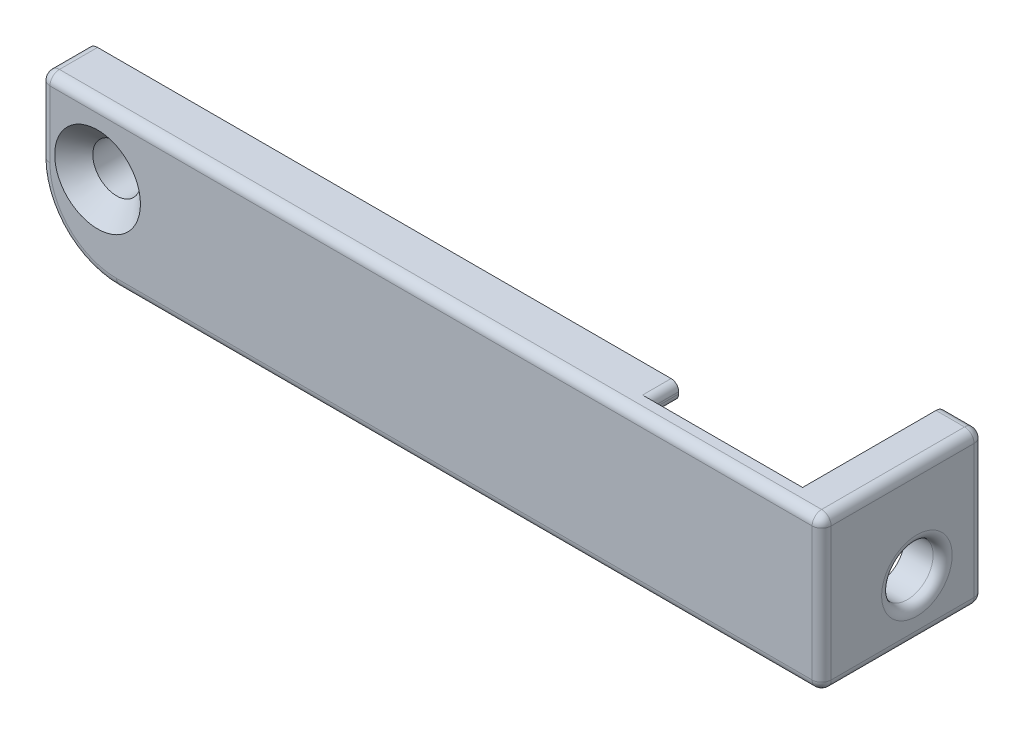
ISO-10303-21;
HEADER;
FILE_DESCRIPTION(('STEP AP214'),'2;1');
FILE_NAME('part.step','',(''),(''),'','','');
FILE_SCHEMA(('AUTOMOTIVE_DESIGN { 1 0 10303 214 1 1 1 1 }'));
ENDSEC;
DATA;
#1=APPLICATION_CONTEXT('core data for automotive mechanical design processes');
#2=APPLICATION_PROTOCOL_DEFINITION('international standard','automotive_design',2000,#1);
#3=PRODUCT_CONTEXT('',#1,'mechanical');
#4=PRODUCT('Part','Part','',(#3));
#5=PRODUCT_RELATED_PRODUCT_CATEGORY('part','',(#4));
#6=PRODUCT_DEFINITION_FORMATION('','',#4);
#7=PRODUCT_DEFINITION_CONTEXT('part definition',#1,'design');
#8=PRODUCT_DEFINITION('design','',#6,#7);
#9=PRODUCT_DEFINITION_SHAPE('','',#8);
#10=(LENGTH_UNIT() NAMED_UNIT(*) SI_UNIT(.MILLI.,.METRE.));
#11=(NAMED_UNIT(*) PLANE_ANGLE_UNIT() SI_UNIT($,.RADIAN.));
#12=(NAMED_UNIT(*) SI_UNIT($,.STERADIAN.) SOLID_ANGLE_UNIT());
#13=UNCERTAINTY_MEASURE_WITH_UNIT(LENGTH_MEASURE(1.E-05),#10,'distance_accuracy_value','');
#14=(GEOMETRIC_REPRESENTATION_CONTEXT(3) GLOBAL_UNCERTAINTY_ASSIGNED_CONTEXT((#13)) GLOBAL_UNIT_ASSIGNED_CONTEXT((#10,
#11,#12)) REPRESENTATION_CONTEXT('',''));
#15=CARTESIAN_POINT('',(0.,0.,0.));
#16=DIRECTION('',(0.,0.,1.));
#17=DIRECTION('',(1.,0.,0.));
#18=AXIS2_PLACEMENT_3D('',#15,#16,#17);
#19=CARTESIAN_POINT('',(0.,0.,0.));
#20=DIRECTION('',(0.,0.,1.));
#21=DIRECTION('',(1.,0.,0.));
#22=AXIS2_PLACEMENT_3D('',#19,#20,#21);
#23=PLANE('',#22);
#24=DIRECTION('',(0.,1.,0.));
#25=VECTOR('',#24,1.);
#26=CARTESIAN_POINT('',(19.5,-4.,0.));
#27=LINE('',#26,#25);
#28=CARTESIAN_POINT('',(19.5,-2.6,0.));
#29=VERTEX_POINT('',#28);
#30=CARTESIAN_POINT('',(19.5,4.,0.));
#31=VERTEX_POINT('',#30);
#32=EDGE_CURVE('E309',#29,#31,#27,.T.);
#33=ORIENTED_EDGE('',*,*,#32,.F.);
#34=CARTESIAN_POINT('',(19.,-2.6,0.));
#35=DIRECTION('',(0.,0.,1.));
#36=DIRECTION('',(1.,0.,0.));
#37=AXIS2_PLACEMENT_3D('',#34,#35,#36);
#38=CIRCLE('',#37,0.5);
#39=CARTESIAN_POINT('',(19.,-3.1,0.));
#40=VERTEX_POINT('',#39);
#41=EDGE_CURVE('E317',#29,#40,#38,.F.);
#42=ORIENTED_EDGE('',*,*,#41,.T.);
#43=DIRECTION('',(1.,0.,0.));
#44=VECTOR('',#43,1.);
#45=CARTESIAN_POINT('',(19.5,-3.1,0.));
#46=LINE('',#45,#44);
#47=CARTESIAN_POINT('',(-14.5,-3.1,0.));
#48=VERTEX_POINT('',#47);
#49=EDGE_CURVE('E246',#48,#40,#46,.T.);
#50=ORIENTED_EDGE('',*,*,#49,.F.);
#51=CARTESIAN_POINT('',(-14.5,-2.6,0.));
#52=DIRECTION('',(0.,0.,1.));
#53=DIRECTION('',(1.,0.,0.));
#54=AXIS2_PLACEMENT_3D('',#51,#52,#53);
#55=CIRCLE('',#54,0.5);
#56=CARTESIAN_POINT('',(-15.,-2.6,0.));
#57=VERTEX_POINT('',#56);
#58=EDGE_CURVE('E543',#48,#57,#55,.F.);
#59=ORIENTED_EDGE('',*,*,#58,.T.);
#60=DIRECTION('',(0.,-1.,0.));
#61=VECTOR('',#60,1.);
#62=CARTESIAN_POINT('',(-15.,3.1,0.));
#63=LINE('',#62,#61);
#64=CARTESIAN_POINT('',(-15.,2.6,0.));
#65=VERTEX_POINT('',#64);
#66=EDGE_CURVE('E391',#65,#57,#63,.T.);
#67=ORIENTED_EDGE('',*,*,#66,.F.);
#68=CARTESIAN_POINT('',(-14.5,2.6,0.));
#69=DIRECTION('',(0.,0.,1.));
#70=DIRECTION('',(1.,0.,0.));
#71=AXIS2_PLACEMENT_3D('',#68,#69,#70);
#72=CIRCLE('',#71,0.5);
#73=CARTESIAN_POINT('',(-14.5,3.1,0.));
#74=VERTEX_POINT('',#73);
#75=EDGE_CURVE('E541',#65,#74,#72,.F.);
#76=ORIENTED_EDGE('',*,*,#75,.T.);
#77=DIRECTION('',(-1.,0.,0.));
#78=VECTOR('',#77,1.);
#79=CARTESIAN_POINT('',(19.5,3.1,0.));
#80=LINE('',#79,#78);
#81=CARTESIAN_POINT('',(11.1,3.1,0.));
#82=VERTEX_POINT('',#81);
#83=EDGE_CURVE('E426',#82,#74,#80,.T.);
#84=ORIENTED_EDGE('',*,*,#83,.F.);
#85=CARTESIAN_POINT('',(11.1,3.5,0.));
#86=DIRECTION('',(0.,0.,1.));
#87=DIRECTION('',(1.,0.,0.));
#88=AXIS2_PLACEMENT_3D('',#85,#86,#87);
#89=CIRCLE('',#88,0.4);
#90=CARTESIAN_POINT('',(11.5,3.5,0.));
#91=VERTEX_POINT('',#90);
#92=EDGE_CURVE('E341',#82,#91,#89,.T.);
#93=ORIENTED_EDGE('',*,*,#92,.T.);
#94=DIRECTION('',(0.,1.,0.));
#95=VECTOR('',#94,1.);
#96=CARTESIAN_POINT('',(11.5,4.,0.));
#97=LINE('',#96,#95);
#98=CARTESIAN_POINT('',(11.5,3.6,0.));
#99=VERTEX_POINT('',#98);
#100=EDGE_CURVE('E410',#91,#99,#97,.T.);
#101=ORIENTED_EDGE('',*,*,#100,.T.);
#102=CARTESIAN_POINT('',(11.1,3.6,0.));
#103=DIRECTION('',(0.,0.,1.));
#104=DIRECTION('',(1.,0.,0.));
#105=AXIS2_PLACEMENT_3D('',#102,#103,#104);
#106=CIRCLE('',#105,0.4);
#107=CARTESIAN_POINT('',(11.1,4.,0.));
#108=VERTEX_POINT('',#107);
#109=EDGE_CURVE('E338',#99,#108,#106,.T.);
#110=ORIENTED_EDGE('',*,*,#109,.T.);
#111=DIRECTION('',(1.,0.,0.));
#112=VECTOR('',#111,1.);
#113=CARTESIAN_POINT('',(19.5,4.,0.));
#114=LINE('',#113,#112);
#115=EDGE_CURVE('E411',#108,#31,#114,.T.);
#116=ORIENTED_EDGE('',*,*,#115,.T.);
#117=EDGE_LOOP('',(#33,#42,#50,#59,#67,#76,#84,#93,#101,#110,#116));
#118=FACE_BOUND('',#117,.T.);
#119=ADVANCED_FACE('F36',(#118),#23,.F.);
#120=CARTESIAN_POINT('',(-19.5,-4.,1.));
#121=DIRECTION('',(1.,0.,0.));
#122=DIRECTION('',(0.,0.,-1.));
#123=AXIS2_PLACEMENT_3D('',#120,#121,#122);
#124=PLANE('',#123);
#125=DIRECTION('',(0.,1.,0.));
#126=VECTOR('',#125,1.);
#127=CARTESIAN_POINT('',(-19.5,4.,-1.5));
#128=LINE('',#127,#126);
#129=CARTESIAN_POINT('',(-19.5,0.,-1.5));
#130=VERTEX_POINT('',#129);
#131=CARTESIAN_POINT('',(-19.5,3.5,-1.5));
#132=VERTEX_POINT('',#131);
#133=EDGE_CURVE('E204',#130,#132,#128,.T.);
#134=ORIENTED_EDGE('',*,*,#133,.F.);
#135=DIRECTION('',(0.,0.,-1.));
#136=VECTOR('',#135,1.);
#137=CARTESIAN_POINT('',(-19.5,0.,1.));
#138=LINE('',#137,#136);
#139=CARTESIAN_POINT('',(-19.5,0.,0.5));
#140=VERTEX_POINT('',#139);
#141=EDGE_CURVE('E208',#130,#140,#138,.F.);
#142=ORIENTED_EDGE('',*,*,#141,.T.);
#143=DIRECTION('',(0.,-1.,0.));
#144=VECTOR('',#143,1.);
#145=CARTESIAN_POINT('',(-19.5,4.,0.5));
#146=LINE('',#145,#144);
#147=CARTESIAN_POINT('',(-19.5,3.5,0.5));
#148=VERTEX_POINT('',#147);
#149=EDGE_CURVE('E438',#140,#148,#146,.F.);
#150=ORIENTED_EDGE('',*,*,#149,.T.);
#151=DIRECTION('',(0.,0.,-1.));
#152=VECTOR('',#151,1.);
#153=CARTESIAN_POINT('',(-19.5,3.5,1.));
#154=LINE('',#153,#152);
#155=EDGE_CURVE('E211',#148,#132,#154,.T.);
#156=ORIENTED_EDGE('',*,*,#155,.T.);
#157=EDGE_LOOP('',(#134,#142,#150,#156));
#158=FACE_BOUND('',#157,.T.);
#159=ADVANCED_FACE('F206',(#158),#124,.F.);
#160=CARTESIAN_POINT('',(19.5,-4.,1.));
#161=DIRECTION('',(0.,1.,0.));
#162=DIRECTION('',(-1.,0.,0.));
#163=AXIS2_PLACEMENT_3D('',#160,#161,#162);
#164=PLANE('',#163);
#165=DIRECTION('',(-1.,0.,0.));
#166=VECTOR('',#165,1.);
#167=CARTESIAN_POINT('',(21.5,-4.,-7.));
#168=LINE('',#167,#166);
#169=CARTESIAN_POINT('',(19.5,-4.,-7.));
#170=VERTEX_POINT('',#169);
#171=CARTESIAN_POINT('',(21.,-4.,-7.));
#172=VERTEX_POINT('',#171);
#173=EDGE_CURVE('E285',#170,#172,#168,.F.);
#174=ORIENTED_EDGE('',*,*,#173,.T.);
#175=DIRECTION('',(0.,0.,-1.));
#176=VECTOR('',#175,1.);
#177=CARTESIAN_POINT('',(21.,-4.,0.5));
#178=LINE('',#177,#176);
#179=CARTESIAN_POINT('',(21.,-4.,0.5));
#180=VERTEX_POINT('',#179);
#181=EDGE_CURVE('E358',#172,#180,#178,.F.);
#182=ORIENTED_EDGE('',*,*,#181,.T.);
#183=DIRECTION('',(1.,0.,0.));
#184=VECTOR('',#183,1.);
#185=CARTESIAN_POINT('',(-15.5,-4.,0.5));
#186=LINE('',#185,#184);
#187=CARTESIAN_POINT('',(-15.5,-4.,0.5));
#188=VERTEX_POINT('',#187);
#189=EDGE_CURVE('E254',#180,#188,#186,.F.);
#190=ORIENTED_EDGE('',*,*,#189,.T.);
#191=DIRECTION('',(0.,0.,-1.));
#192=VECTOR('',#191,1.);
#193=CARTESIAN_POINT('',(-15.5,-4.,1.));
#194=LINE('',#193,#192);
#195=CARTESIAN_POINT('',(-15.5,-4.,-1.5));
#196=VERTEX_POINT('',#195);
#197=EDGE_CURVE('E228',#188,#196,#194,.T.);
#198=ORIENTED_EDGE('',*,*,#197,.T.);
#199=DIRECTION('',(-1.,0.,0.));
#200=VECTOR('',#199,1.);
#201=CARTESIAN_POINT('',(19.5,-4.,-1.5));
#202=LINE('',#201,#200);
#203=CARTESIAN_POINT('',(19.5,-4.,-1.5));
#204=VERTEX_POINT('',#203);
#205=EDGE_CURVE('E225',#204,#196,#202,.T.);
#206=ORIENTED_EDGE('',*,*,#205,.F.);
#207=DIRECTION('',(0.,0.,-1.));
#208=VECTOR('',#207,1.);
#209=CARTESIAN_POINT('',(19.5,-4.,0.999999999999999));
#210=LINE('',#209,#208);
#211=EDGE_CURVE('E414',#204,#170,#210,.T.);
#212=ORIENTED_EDGE('',*,*,#211,.T.);
#213=EDGE_LOOP('',(#174,#182,#190,#198,#206,#212));
#214=FACE_BOUND('',#213,.T.);
#215=ADVANCED_FACE('F494',(#214),#164,.F.);
#216=CARTESIAN_POINT('',(19.5,4.,1.));
#217=DIRECTION('',(0.,-1.,0.));
#218=DIRECTION('',(1.,0.,0.));
#219=AXIS2_PLACEMENT_3D('',#216,#217,#218);
#220=PLANE('',#219);
#221=DIRECTION('',(-1.,0.,0.));
#222=VECTOR('',#221,1.);
#223=CARTESIAN_POINT('',(21.5,4.,0.5));
#224=LINE('',#223,#222);
#225=CARTESIAN_POINT('',(-19.,4.,0.5));
#226=VERTEX_POINT('',#225);
#227=CARTESIAN_POINT('',(21.,4.,0.5));
#228=VERTEX_POINT('',#227);
#229=EDGE_CURVE('E250',#226,#228,#224,.F.);
#230=ORIENTED_EDGE('',*,*,#229,.T.);
#231=DIRECTION('',(0.,0.,-1.));
#232=VECTOR('',#231,1.);
#233=CARTESIAN_POINT('',(21.,4.,-7.));
#234=LINE('',#233,#232);
#235=CARTESIAN_POINT('',(21.,4.,-7.));
#236=VERTEX_POINT('',#235);
#237=EDGE_CURVE('E61',#228,#236,#234,.T.);
#238=ORIENTED_EDGE('',*,*,#237,.T.);
#239=DIRECTION('',(-1.,0.,0.));
#240=VECTOR('',#239,1.);
#241=CARTESIAN_POINT('',(19.5,4.,-7.));
#242=LINE('',#241,#240);
#243=CARTESIAN_POINT('',(19.5,4.,-7.));
#244=VERTEX_POINT('',#243);
#245=EDGE_CURVE('E256',#236,#244,#242,.T.);
#246=ORIENTED_EDGE('',*,*,#245,.T.);
#247=DIRECTION('',(0.,0.,-1.));
#248=VECTOR('',#247,1.);
#249=CARTESIAN_POINT('',(19.5,4.,1.));
#250=LINE('',#249,#248);
#251=EDGE_CURVE('E425',#31,#244,#250,.T.);
#252=ORIENTED_EDGE('',*,*,#251,.F.);
#253=ORIENTED_EDGE('',*,*,#115,.F.);
#254=DIRECTION('',(0.,0.,-1.));
#255=VECTOR('',#254,1.);
#256=CARTESIAN_POINT('',(11.1,4.,1.));
#257=LINE('',#256,#255);
#258=CARTESIAN_POINT('',(11.1,4.,-1.5));
#259=VERTEX_POINT('',#258);
#260=EDGE_CURVE('E324',#108,#259,#257,.T.);
#261=ORIENTED_EDGE('',*,*,#260,.T.);
#262=DIRECTION('',(1.,0.,0.));
#263=VECTOR('',#262,1.);
#264=CARTESIAN_POINT('',(19.5,4.,-1.5));
#265=LINE('',#264,#263);
#266=CARTESIAN_POINT('',(-19.,4.,-1.5));
#267=VERTEX_POINT('',#266);
#268=EDGE_CURVE('E214',#267,#259,#265,.T.);
#269=ORIENTED_EDGE('',*,*,#268,.F.);
#270=DIRECTION('',(0.,0.,-1.));
#271=VECTOR('',#270,1.);
#272=CARTESIAN_POINT('',(-19.,4.,1.));
#273=LINE('',#272,#271);
#274=EDGE_CURVE('E252',#267,#226,#273,.F.);
#275=ORIENTED_EDGE('',*,*,#274,.T.);
#276=EDGE_LOOP('',(#230,#238,#246,#252,#253,#261,#269,#275));
#277=FACE_BOUND('',#276,.T.);
#278=ADVANCED_FACE('F460',(#277),#220,.F.);
#279=CARTESIAN_POINT('',(0.,0.,1.));
#280=DIRECTION('',(0.,0.,1.));
#281=DIRECTION('',(1.,0.,0.));
#282=AXIS2_PLACEMENT_3D('',#279,#280,#281);
#283=PLANE('',#282);
#284=CARTESIAN_POINT('',(-16.5,0.499999999999986,1.));
#285=DIRECTION('',(0.,0.,1.));
#286=DIRECTION('',(1.,0.,0.));
#287=AXIS2_PLACEMENT_3D('',#284,#285,#286);
#288=CIRCLE('',#287,2.25);
#289=CARTESIAN_POINT('',(-14.25,0.499999999999986,1.));
#290=VERTEX_POINT('',#289);
#291=EDGE_CURVE('E291',#290,#290,#288,.T.);
#292=ORIENTED_EDGE('',*,*,#291,.F.);
#293=EDGE_LOOP('',(#292));
#294=FACE_BOUND('',#293,.T.);
#295=DIRECTION('',(1.,0.,0.));
#296=VECTOR('',#295,1.);
#297=CARTESIAN_POINT('',(21.5,-3.5,1.));
#298=LINE('',#297,#296);
#299=CARTESIAN_POINT('',(-15.5,-3.5,1.));
#300=VERTEX_POINT('',#299);
#301=CARTESIAN_POINT('',(21.,-3.5,1.));
#302=VERTEX_POINT('',#301);
#303=EDGE_CURVE('E233',#300,#302,#298,.T.);
#304=ORIENTED_EDGE('',*,*,#303,.T.);
#305=DIRECTION('',(0.,-1.,0.));
#306=VECTOR('',#305,1.);
#307=CARTESIAN_POINT('',(21.,0.,1.));
#308=LINE('',#307,#306);
#309=CARTESIAN_POINT('',(21.,3.5,1.));
#310=VERTEX_POINT('',#309);
#311=EDGE_CURVE('E362',#302,#310,#308,.F.);
#312=ORIENTED_EDGE('',*,*,#311,.T.);
#313=DIRECTION('',(-1.,0.,0.));
#314=VECTOR('',#313,1.);
#315=CARTESIAN_POINT('',(-19.5,3.5,1.));
#316=LINE('',#315,#314);
#317=CARTESIAN_POINT('',(-19.,3.5,1.));
#318=VERTEX_POINT('',#317);
#319=EDGE_CURVE('E436',#310,#318,#316,.T.);
#320=ORIENTED_EDGE('',*,*,#319,.T.);
#321=DIRECTION('',(0.,-1.,0.));
#322=VECTOR('',#321,1.);
#323=CARTESIAN_POINT('',(-19.,0.,1.));
#324=LINE('',#323,#322);
#325=CARTESIAN_POINT('',(-19.,0.,1.));
#326=VERTEX_POINT('',#325);
#327=EDGE_CURVE('E433',#318,#326,#324,.T.);
#328=ORIENTED_EDGE('',*,*,#327,.T.);
#329=CARTESIAN_POINT('',(-15.5,0.,1.));
#330=DIRECTION('',(0.,0.,1.));
#331=DIRECTION('',(1.,0.,0.));
#332=AXIS2_PLACEMENT_3D('',#329,#330,#331);
#333=CIRCLE('',#332,3.5);
#334=EDGE_CURVE('E236',#326,#300,#333,.T.);
#335=ORIENTED_EDGE('',*,*,#334,.T.);
#336=EDGE_LOOP('',(#304,#312,#320,#328,#335));
#337=FACE_BOUND('',#336,.T.);
#338=ADVANCED_FACE('F453',(#294,#337),#283,.T.);
#339=CARTESIAN_POINT('',(19.5,-3.1,-1.5));
#340=DIRECTION('',(0.,-1.,0.));
#341=DIRECTION('',(0.,0.,-1.));
#342=AXIS2_PLACEMENT_3D('',#339,#340,#341);
#343=PLANE('',#342);
#344=ORIENTED_EDGE('',*,*,#49,.T.);
#345=DIRECTION('',(0.,0.,1.));
#346=VECTOR('',#345,1.);
#347=CARTESIAN_POINT('',(19.,-3.1,-1.5));
#348=LINE('',#347,#346);
#349=CARTESIAN_POINT('',(19.,-3.1,-1.5));
#350=VERTEX_POINT('',#349);
#351=EDGE_CURVE('E319',#40,#350,#348,.F.);
#352=ORIENTED_EDGE('',*,*,#351,.T.);
#353=DIRECTION('',(1.,0.,0.));
#354=VECTOR('',#353,1.);
#355=CARTESIAN_POINT('',(19.5,-3.1,-1.5));
#356=LINE('',#355,#354);
#357=CARTESIAN_POINT('',(-14.5,-3.1,-1.5));
#358=VERTEX_POINT('',#357);
#359=EDGE_CURVE('E305',#358,#350,#356,.T.);
#360=ORIENTED_EDGE('',*,*,#359,.F.);
#361=DIRECTION('',(0.,0.,-1.));
#362=VECTOR('',#361,1.);
#363=CARTESIAN_POINT('',(-14.5,-3.1,-1.5));
#364=LINE('',#363,#362);
#365=EDGE_CURVE('E296',#358,#48,#364,.F.);
#366=ORIENTED_EDGE('',*,*,#365,.T.);
#367=EDGE_LOOP('',(#344,#352,#360,#366));
#368=FACE_BOUND('',#367,.T.);
#369=ADVANCED_FACE('F538',(#368),#343,.F.);
#370=CARTESIAN_POINT('',(0.,0.,-1.5));
#371=DIRECTION('',(0.,0.,1.));
#372=DIRECTION('',(1.,0.,0.));
#373=AXIS2_PLACEMENT_3D('',#370,#371,#372);
#374=PLANE('',#373);
#375=ORIENTED_EDGE('',*,*,#268,.T.);
#376=CARTESIAN_POINT('',(11.1,3.6,-1.5));
#377=DIRECTION('',(0.,0.,1.));
#378=DIRECTION('',(1.,0.,0.));
#379=AXIS2_PLACEMENT_3D('',#376,#377,#378);
#380=CIRCLE('',#379,0.4);
#381=CARTESIAN_POINT('',(11.5,3.6,-1.5));
#382=VERTEX_POINT('',#381);
#383=EDGE_CURVE('E329',#259,#382,#380,.F.);
#384=ORIENTED_EDGE('',*,*,#383,.T.);
#385=DIRECTION('',(0.,1.,0.));
#386=VECTOR('',#385,1.);
#387=CARTESIAN_POINT('',(11.5,4.,-1.5));
#388=LINE('',#387,#386);
#389=CARTESIAN_POINT('',(11.5,3.5,-1.5));
#390=VERTEX_POINT('',#389);
#391=EDGE_CURVE('E272',#390,#382,#388,.T.);
#392=ORIENTED_EDGE('',*,*,#391,.F.);
#393=CARTESIAN_POINT('',(11.1,3.5,-1.5));
#394=DIRECTION('',(0.,0.,1.));
#395=DIRECTION('',(1.,0.,0.));
#396=AXIS2_PLACEMENT_3D('',#393,#394,#395);
#397=CIRCLE('',#396,0.4);
#398=CARTESIAN_POINT('',(11.1,3.1,-1.5));
#399=VERTEX_POINT('',#398);
#400=EDGE_CURVE('E327',#390,#399,#397,.F.);
#401=ORIENTED_EDGE('',*,*,#400,.T.);
#402=DIRECTION('',(-1.,0.,0.));
#403=VECTOR('',#402,1.);
#404=CARTESIAN_POINT('',(19.5,3.1,-1.5));
#405=LINE('',#404,#403);
#406=CARTESIAN_POINT('',(-14.5,3.1,-1.5));
#407=VERTEX_POINT('',#406);
#408=EDGE_CURVE('E215',#399,#407,#405,.T.);
#409=ORIENTED_EDGE('',*,*,#408,.T.);
#410=CARTESIAN_POINT('',(-14.5,2.6,-1.5));
#411=DIRECTION('',(0.,0.,1.));
#412=DIRECTION('',(1.,0.,0.));
#413=AXIS2_PLACEMENT_3D('',#410,#411,#412);
#414=CIRCLE('',#413,0.5);
#415=CARTESIAN_POINT('',(-15.,2.6,-1.5));
#416=VERTEX_POINT('',#415);
#417=EDGE_CURVE('E312',#407,#416,#414,.T.);
#418=ORIENTED_EDGE('',*,*,#417,.T.);
#419=DIRECTION('',(0.,-1.,0.));
#420=VECTOR('',#419,1.);
#421=CARTESIAN_POINT('',(-15.,3.1,-1.5));
#422=LINE('',#421,#420);
#423=CARTESIAN_POINT('',(-15.,-2.6,-1.5));
#424=VERTEX_POINT('',#423);
#425=EDGE_CURVE('E402',#416,#424,#422,.T.);
#426=ORIENTED_EDGE('',*,*,#425,.T.);
#427=CARTESIAN_POINT('',(-14.5,-2.6,-1.5));
#428=DIRECTION('',(0.,0.,1.));
#429=DIRECTION('',(1.,0.,0.));
#430=AXIS2_PLACEMENT_3D('',#427,#428,#429);
#431=CIRCLE('',#430,0.5);
#432=EDGE_CURVE('E551',#424,#358,#431,.T.);
#433=ORIENTED_EDGE('',*,*,#432,.T.);
#434=ORIENTED_EDGE('',*,*,#359,.T.);
#435=CARTESIAN_POINT('',(19.,-2.6,-1.5));
#436=DIRECTION('',(0.,0.,1.));
#437=DIRECTION('',(1.,0.,0.));
#438=AXIS2_PLACEMENT_3D('',#435,#436,#437);
#439=CIRCLE('',#438,0.5);
#440=CARTESIAN_POINT('',(19.5,-2.6,-1.5));
#441=VERTEX_POINT('',#440);
#442=EDGE_CURVE('E321',#350,#441,#439,.T.);
#443=ORIENTED_EDGE('',*,*,#442,.T.);
#444=DIRECTION('',(0.,-1.,0.));
#445=VECTOR('',#444,1.);
#446=CARTESIAN_POINT('',(19.5,-4.,-1.5));
#447=LINE('',#446,#445);
#448=EDGE_CURVE('E300',#441,#204,#447,.T.);
#449=ORIENTED_EDGE('',*,*,#448,.T.);
#450=ORIENTED_EDGE('',*,*,#205,.T.);
#451=CARTESIAN_POINT('',(-15.5,0.,-1.5));
#452=DIRECTION('',(0.,0.,1.));
#453=DIRECTION('',(1.,0.,0.));
#454=AXIS2_PLACEMENT_3D('',#451,#452,#453);
#455=CIRCLE('',#454,4.);
#456=EDGE_CURVE('E219',#196,#130,#455,.F.);
#457=ORIENTED_EDGE('',*,*,#456,.T.);
#458=ORIENTED_EDGE('',*,*,#133,.T.);
#459=CARTESIAN_POINT('',(-19.,3.5,-1.5));
#460=DIRECTION('',(0.,0.,-1.));
#461=DIRECTION('',(-1.,0.,0.));
#462=AXIS2_PLACEMENT_3D('',#459,#460,#461);
#463=CIRCLE('',#462,0.5);
#464=EDGE_CURVE('E248',#132,#267,#463,.T.);
#465=ORIENTED_EDGE('',*,*,#464,.T.);
#466=EDGE_LOOP('',(#375,#384,#392,#401,#409,#418,#426,#433,#434,#443,#449,#450,#457,#458,#465));
#467=FACE_BOUND('',#466,.T.);
#468=CARTESIAN_POINT('',(-16.5,0.499999999999986,-1.5));
#469=DIRECTION('',(0.,0.,-1.));
#470=DIRECTION('',(-1.,0.,0.));
#471=AXIS2_PLACEMENT_3D('',#468,#469,#470);
#472=CIRCLE('',#471,1.25);
#473=CARTESIAN_POINT('',(-17.75,0.499999999999986,-1.5));
#474=VERTEX_POINT('',#473);
#475=EDGE_CURVE('E396',#474,#474,#472,.T.);
#476=ORIENTED_EDGE('',*,*,#475,.F.);
#477=EDGE_LOOP('',(#476));
#478=FACE_BOUND('',#477,.T.);
#479=ADVANCED_FACE('F221',(#467,#478),#374,.F.);
#480=CARTESIAN_POINT('',(19.5,3.1,-1.5));
#481=DIRECTION('',(0.,1.,0.));
#482=DIRECTION('',(0.,0.,1.));
#483=AXIS2_PLACEMENT_3D('',#480,#481,#482);
#484=PLANE('',#483);
#485=ORIENTED_EDGE('',*,*,#408,.F.);
#486=DIRECTION('',(0.,0.,-1.));
#487=VECTOR('',#486,1.);
#488=CARTESIAN_POINT('',(11.1,3.1,-1.5));
#489=LINE('',#488,#487);
#490=EDGE_CURVE('E336',#399,#82,#489,.F.);
#491=ORIENTED_EDGE('',*,*,#490,.T.);
#492=ORIENTED_EDGE('',*,*,#83,.T.);
#493=DIRECTION('',(0.,0.,-1.));
#494=VECTOR('',#493,1.);
#495=CARTESIAN_POINT('',(-14.5,3.1,-1.5));
#496=LINE('',#495,#494);
#497=EDGE_CURVE('E547',#74,#407,#496,.T.);
#498=ORIENTED_EDGE('',*,*,#497,.T.);
#499=EDGE_LOOP('',(#485,#491,#492,#498));
#500=FACE_BOUND('',#499,.T.);
#501=ADVANCED_FACE('F561',(#500),#484,.F.);
#502=CARTESIAN_POINT('',(-15.5,0.,1.));
#503=DIRECTION('',(0.,0.,-1.));
#504=DIRECTION('',(-1.,0.,0.));
#505=AXIS2_PLACEMENT_3D('',#502,#503,#504);
#506=CYLINDRICAL_SURFACE('',#505,4.);
#507=ORIENTED_EDGE('',*,*,#197,.F.);
#508=CARTESIAN_POINT('',(-15.5,0.,0.5));
#509=DIRECTION('',(0.,0.,1.));
#510=DIRECTION('',(1.,0.,0.));
#511=AXIS2_PLACEMENT_3D('',#508,#509,#510);
#512=CIRCLE('',#511,4.);
#513=EDGE_CURVE('E232',#188,#140,#512,.F.);
#514=ORIENTED_EDGE('',*,*,#513,.T.);
#515=ORIENTED_EDGE('',*,*,#141,.F.);
#516=ORIENTED_EDGE('',*,*,#456,.F.);
#517=EDGE_LOOP('',(#507,#514,#515,#516));
#518=FACE_BOUND('',#517,.T.);
#519=ADVANCED_FACE('F230',(#518),#506,.T.);
#520=CARTESIAN_POINT('',(21.5,4.,-7.5));
#521=DIRECTION('',(0.,0.,-1.));
#522=DIRECTION('',(0.,1.,0.));
#523=AXIS2_PLACEMENT_3D('',#520,#521,#522);
#524=PLANE('',#523);
#525=DIRECTION('',(-1.,0.,0.));
#526=VECTOR('',#525,1.);
#527=CARTESIAN_POINT('',(21.5,3.5,-7.5));
#528=LINE('',#527,#526);
#529=CARTESIAN_POINT('',(19.5,3.5,-7.5));
#530=VERTEX_POINT('',#529);
#531=CARTESIAN_POINT('',(21.,3.5,-7.5));
#532=VERTEX_POINT('',#531);
#533=EDGE_CURVE('E283',#530,#532,#528,.F.);
#534=ORIENTED_EDGE('',*,*,#533,.T.);
#535=DIRECTION('',(0.,-1.,0.));
#536=VECTOR('',#535,1.);
#537=CARTESIAN_POINT('',(21.,4.,-7.5));
#538=LINE('',#537,#536);
#539=CARTESIAN_POINT('',(21.,-3.5,-7.5));
#540=VERTEX_POINT('',#539);
#541=EDGE_CURVE('E45',#532,#540,#538,.T.);
#542=ORIENTED_EDGE('',*,*,#541,.T.);
#543=DIRECTION('',(-1.,0.,0.));
#544=VECTOR('',#543,1.);
#545=CARTESIAN_POINT('',(19.5,-3.5,-7.5));
#546=LINE('',#545,#544);
#547=CARTESIAN_POINT('',(19.5,-3.5,-7.5));
#548=VERTEX_POINT('',#547);
#549=EDGE_CURVE('E281',#540,#548,#546,.T.);
#550=ORIENTED_EDGE('',*,*,#549,.T.);
#551=DIRECTION('',(0.,-1.,0.));
#552=VECTOR('',#551,1.);
#553=CARTESIAN_POINT('',(19.5,4.,-7.5));
#554=LINE('',#553,#552);
#555=EDGE_CURVE('E419',#530,#548,#554,.T.);
#556=ORIENTED_EDGE('',*,*,#555,.F.);
#557=EDGE_LOOP('',(#534,#542,#550,#556));
#558=FACE_BOUND('',#557,.T.);
#559=ADVANCED_FACE('F476',(#558),#524,.T.);
#560=CARTESIAN_POINT('',(21.5,0.,0.));
#561=DIRECTION('',(1.,0.,0.));
#562=DIRECTION('',(0.,0.,-1.));
#563=AXIS2_PLACEMENT_3D('',#560,#561,#562);
#564=PLANE('',#563);
#565=DIRECTION('',(0.,-1.,0.));
#566=VECTOR('',#565,1.);
#567=CARTESIAN_POINT('',(21.5,0.,0.5));
#568=LINE('',#567,#566);
#569=CARTESIAN_POINT('',(21.5,3.5,0.5));
#570=VERTEX_POINT('',#569);
#571=CARTESIAN_POINT('',(21.5,-3.5,0.5));
#572=VERTEX_POINT('',#571);
#573=EDGE_CURVE('E353',#570,#572,#568,.T.);
#574=ORIENTED_EDGE('',*,*,#573,.T.);
#575=DIRECTION('',(0.,0.,-1.));
#576=VECTOR('',#575,1.);
#577=CARTESIAN_POINT('',(21.5,-3.5,-7.));
#578=LINE('',#577,#576);
#579=CARTESIAN_POINT('',(21.5,-3.5,-7.));
#580=VERTEX_POINT('',#579);
#581=EDGE_CURVE('E355',#572,#580,#578,.T.);
#582=ORIENTED_EDGE('',*,*,#581,.T.);
#583=DIRECTION('',(0.,-1.,0.));
#584=VECTOR('',#583,1.);
#585=CARTESIAN_POINT('',(21.5,0.,-7.));
#586=LINE('',#585,#584);
#587=CARTESIAN_POINT('',(21.5,3.5,-7.));
#588=VERTEX_POINT('',#587);
#589=EDGE_CURVE('E349',#580,#588,#586,.F.);
#590=ORIENTED_EDGE('',*,*,#589,.T.);
#591=DIRECTION('',(0.,0.,-1.));
#592=VECTOR('',#591,1.);
#593=CARTESIAN_POINT('',(21.5,3.5,0.5));
#594=LINE('',#593,#592);
#595=EDGE_CURVE('E351',#588,#570,#594,.F.);
#596=ORIENTED_EDGE('',*,*,#595,.T.);
#597=EDGE_LOOP('',(#574,#582,#590,#596));
#598=FACE_BOUND('',#597,.T.);
#599=CARTESIAN_POINT('',(21.5,-0.999999999999997,-4.));
#600=DIRECTION('',(1.,0.,0.));
#601=DIRECTION('',(0.,0.,-1.));
#602=AXIS2_PLACEMENT_3D('',#599,#600,#601);
#603=CIRCLE('',#602,1.85);
#604=CARTESIAN_POINT('',(21.5,-0.999999999999997,-5.85));
#605=VERTEX_POINT('',#604);
#606=EDGE_CURVE('E346',#605,#605,#603,.F.);
#607=ORIENTED_EDGE('',*,*,#606,.T.);
#608=EDGE_LOOP('',(#607));
#609=FACE_BOUND('',#608,.T.);
#610=ADVANCED_FACE('F504',(#598,#609),#564,.T.);
#611=CARTESIAN_POINT('',(19.5,0.,0.));
#612=DIRECTION('',(1.,0.,0.));
#613=DIRECTION('',(0.,0.,-1.));
#614=AXIS2_PLACEMENT_3D('',#611,#612,#613);
#615=PLANE('',#614);
#616=CARTESIAN_POINT('',(19.5,-0.999999999999997,-4.));
#617=DIRECTION('',(1.,0.,0.));
#618=DIRECTION('',(0.,0.,-1.));
#619=AXIS2_PLACEMENT_3D('',#616,#617,#618);
#620=CIRCLE('',#619,1.35);
#621=CARTESIAN_POINT('',(19.5,-0.999999999999997,-5.35));
#622=VERTEX_POINT('',#621);
#623=EDGE_CURVE('E260',#622,#622,#620,.T.);
#624=ORIENTED_EDGE('',*,*,#623,.T.);
#625=EDGE_LOOP('',(#624));
#626=FACE_BOUND('',#625,.T.);
#627=ORIENTED_EDGE('',*,*,#448,.F.);
#628=DIRECTION('',(0.,0.,1.));
#629=VECTOR('',#628,1.);
#630=CARTESIAN_POINT('',(19.5,-2.6,0.));
#631=LINE('',#630,#629);
#632=EDGE_CURVE('E314',#441,#29,#631,.T.);
#633=ORIENTED_EDGE('',*,*,#632,.T.);
#634=ORIENTED_EDGE('',*,*,#32,.T.);
#635=ORIENTED_EDGE('',*,*,#251,.T.);
#636=CARTESIAN_POINT('',(19.5,3.5,-7.));
#637=DIRECTION('',(1.,0.,0.));
#638=DIRECTION('',(0.,0.,-1.));
#639=AXIS2_PLACEMENT_3D('',#636,#637,#638);
#640=CIRCLE('',#639,0.5);
#641=EDGE_CURVE('E279',#244,#530,#640,.F.);
#642=ORIENTED_EDGE('',*,*,#641,.T.);
#643=ORIENTED_EDGE('',*,*,#555,.T.);
#644=CARTESIAN_POINT('',(19.5,-3.5,-7.));
#645=DIRECTION('',(1.,0.,0.));
#646=DIRECTION('',(0.,0.,-1.));
#647=AXIS2_PLACEMENT_3D('',#644,#645,#646);
#648=CIRCLE('',#647,0.5);
#649=EDGE_CURVE('E277',#548,#170,#648,.F.);
#650=ORIENTED_EDGE('',*,*,#649,.T.);
#651=ORIENTED_EDGE('',*,*,#211,.F.);
#652=EDGE_LOOP('',(#627,#633,#634,#635,#642,#643,#650,#651));
#653=FACE_BOUND('',#652,.T.);
#654=ADVANCED_FACE('F507',(#626,#653),#615,.F.);
#655=CARTESIAN_POINT('',(11.5,4.,8.05046582503149));
#656=DIRECTION('',(-1.,0.,0.));
#657=DIRECTION('',(0.,0.,1.));
#658=AXIS2_PLACEMENT_3D('',#655,#656,#657);
#659=PLANE('',#658);
#660=ORIENTED_EDGE('',*,*,#391,.T.);
#661=DIRECTION('',(0.,0.,-1.));
#662=VECTOR('',#661,1.);
#663=CARTESIAN_POINT('',(11.5,3.6,8.05046582503149));
#664=LINE('',#663,#662);
#665=EDGE_CURVE('E334',#382,#99,#664,.F.);
#666=ORIENTED_EDGE('',*,*,#665,.T.);
#667=ORIENTED_EDGE('',*,*,#100,.F.);
#668=DIRECTION('',(0.,0.,-1.));
#669=VECTOR('',#668,1.);
#670=CARTESIAN_POINT('',(11.5,3.5,8.05046582503149));
#671=LINE('',#670,#669);
#672=EDGE_CURVE('E331',#91,#390,#671,.T.);
#673=ORIENTED_EDGE('',*,*,#672,.T.);
#674=EDGE_LOOP('',(#660,#666,#667,#673));
#675=FACE_BOUND('',#674,.T.);
#676=ADVANCED_FACE('F524',(#675),#659,.F.);
#677=CARTESIAN_POINT('',(-19.,3.5,1.));
#678=DIRECTION('',(0.,0.,-1.));
#679=DIRECTION('',(-1.,0.,0.));
#680=AXIS2_PLACEMENT_3D('',#677,#678,#679);
#681=CYLINDRICAL_SURFACE('',#680,0.5);
#682=ORIENTED_EDGE('',*,*,#464,.F.);
#683=ORIENTED_EDGE('',*,*,#155,.F.);
#684=CARTESIAN_POINT('',(-19.,3.5,0.5));
#685=DIRECTION('',(0.,0.,1.));
#686=DIRECTION('',(1.,0.,0.));
#687=AXIS2_PLACEMENT_3D('',#684,#685,#686);
#688=CIRCLE('',#687,0.5);
#689=EDGE_CURVE('E269',#226,#148,#688,.T.);
#690=ORIENTED_EDGE('',*,*,#689,.F.);
#691=ORIENTED_EDGE('',*,*,#274,.F.);
#692=EDGE_LOOP('',(#682,#683,#690,#691));
#693=FACE_BOUND('',#692,.T.);
#694=ADVANCED_FACE('F443',(#693),#681,.T.);
#695=CARTESIAN_POINT('',(0.,3.5,0.5));
#696=DIRECTION('',(1.,0.,0.));
#697=DIRECTION('',(0.,1.,0.));
#698=AXIS2_PLACEMENT_3D('',#695,#696,#697);
#699=CYLINDRICAL_SURFACE('',#698,0.5);
#700=ORIENTED_EDGE('',*,*,#319,.F.);
#701=CARTESIAN_POINT('',(21.,3.5,0.5));
#702=DIRECTION('',(1.,0.,0.));
#703=DIRECTION('',(0.,1.,0.));
#704=AXIS2_PLACEMENT_3D('',#701,#702,#703);
#705=CIRCLE('',#704,0.5);
#706=EDGE_CURVE('E364',#310,#228,#705,.F.);
#707=ORIENTED_EDGE('',*,*,#706,.T.);
#708=ORIENTED_EDGE('',*,*,#229,.F.);
#709=CARTESIAN_POINT('',(-19.,3.5,0.5));
#710=DIRECTION('',(-1.,0.,0.));
#711=DIRECTION('',(0.,0.,1.));
#712=AXIS2_PLACEMENT_3D('',#709,#710,#711);
#713=CIRCLE('',#712,0.5);
#714=EDGE_CURVE('E266',#318,#226,#713,.T.);
#715=ORIENTED_EDGE('',*,*,#714,.F.);
#716=EDGE_LOOP('',(#700,#707,#708,#715));
#717=FACE_BOUND('',#716,.T.);
#718=ADVANCED_FACE('F459',(#717),#699,.T.);
#719=CARTESIAN_POINT('',(0.,-3.5,0.5));
#720=DIRECTION('',(-1.,0.,0.));
#721=DIRECTION('',(0.,-1.,0.));
#722=AXIS2_PLACEMENT_3D('',#719,#720,#721);
#723=CYLINDRICAL_SURFACE('',#722,0.5);
#724=ORIENTED_EDGE('',*,*,#189,.F.);
#725=CARTESIAN_POINT('',(21.,-3.5,0.5));
#726=DIRECTION('',(-1.,0.,0.));
#727=DIRECTION('',(0.,-1.,0.));
#728=AXIS2_PLACEMENT_3D('',#725,#726,#727);
#729=CIRCLE('',#728,0.5);
#730=EDGE_CURVE('E360',#180,#302,#729,.T.);
#731=ORIENTED_EDGE('',*,*,#730,.T.);
#732=ORIENTED_EDGE('',*,*,#303,.F.);
#733=CARTESIAN_POINT('',(-15.5,-3.5,0.5));
#734=DIRECTION('',(-1.,0.,0.));
#735=DIRECTION('',(0.,0.,1.));
#736=AXIS2_PLACEMENT_3D('',#733,#734,#735);
#737=CIRCLE('',#736,0.5);
#738=EDGE_CURVE('E263',#188,#300,#737,.T.);
#739=ORIENTED_EDGE('',*,*,#738,.F.);
#740=EDGE_LOOP('',(#724,#731,#732,#739));
#741=FACE_BOUND('',#740,.T.);
#742=ADVANCED_FACE('F498',(#741),#723,.T.);
#743=CARTESIAN_POINT('',(-19.,3.5,0.5));
#744=DIRECTION('',(0.,0.,1.));
#745=DIRECTION('',(1.,0.,0.));
#746=AXIS2_PLACEMENT_3D('',#743,#744,#745);
#747=SPHERICAL_SURFACE('',#746,0.5);
#748=ORIENTED_EDGE('',*,*,#714,.T.);
#749=ORIENTED_EDGE('',*,*,#689,.T.);
#750=CARTESIAN_POINT('',(-19.,3.5,0.5));
#751=DIRECTION('',(0.,1.,0.));
#752=DIRECTION('',(0.,0.,1.));
#753=AXIS2_PLACEMENT_3D('',#750,#751,#752);
#754=CIRCLE('',#753,0.5);
#755=EDGE_CURVE('E259',#318,#148,#754,.F.);
#756=ORIENTED_EDGE('',*,*,#755,.F.);
#757=EDGE_LOOP('',(#748,#749,#756));
#758=FACE_BOUND('',#757,.T.);
#759=ADVANCED_FACE('F447',(#758),#747,.T.);
#760=CARTESIAN_POINT('',(-15.5,0.,0.5));
#761=DIRECTION('',(0.,0.,1.));
#762=DIRECTION('',(1.,0.,0.));
#763=AXIS2_PLACEMENT_3D('',#760,#761,#762);
#764=TOROIDAL_SURFACE('',#763,3.5,0.5);
#765=ORIENTED_EDGE('',*,*,#738,.T.);
#766=ORIENTED_EDGE('',*,*,#334,.F.);
#767=CARTESIAN_POINT('',(-19.,0.,0.5));
#768=DIRECTION('',(0.,1.,0.));
#769=DIRECTION('',(0.,0.,1.));
#770=AXIS2_PLACEMENT_3D('',#767,#768,#769);
#771=CIRCLE('',#770,0.5);
#772=EDGE_CURVE('E257',#140,#326,#771,.T.);
#773=ORIENTED_EDGE('',*,*,#772,.F.);
#774=ORIENTED_EDGE('',*,*,#513,.F.);
#775=EDGE_LOOP('',(#765,#766,#773,#774));
#776=FACE_BOUND('',#775,.T.);
#777=ADVANCED_FACE('F603',(#776),#764,.T.);
#778=CARTESIAN_POINT('',(-19.,0.,0.5));
#779=DIRECTION('',(0.,1.,0.));
#780=DIRECTION('',(0.,0.,1.));
#781=AXIS2_PLACEMENT_3D('',#778,#779,#780);
#782=CYLINDRICAL_SURFACE('',#781,0.5);
#783=ORIENTED_EDGE('',*,*,#755,.T.);
#784=ORIENTED_EDGE('',*,*,#149,.F.);
#785=ORIENTED_EDGE('',*,*,#772,.T.);
#786=ORIENTED_EDGE('',*,*,#327,.F.);
#787=EDGE_LOOP('',(#783,#784,#785,#786));
#788=FACE_BOUND('',#787,.T.);
#789=ADVANCED_FACE('F450',(#788),#782,.T.);
#790=CARTESIAN_POINT('',(18.5,-0.999999999999997,-4.));
#791=DIRECTION('',(1.,0.,0.));
#792=DIRECTION('',(0.,0.,-1.));
#793=AXIS2_PLACEMENT_3D('',#790,#791,#792);
#794=CYLINDRICAL_SURFACE('',#793,1.35);
#795=CARTESIAN_POINT('',(21.,-0.999999999999997,-4.));
#796=DIRECTION('',(1.,0.,0.));
#797=DIRECTION('',(0.,0.,-1.));
#798=AXIS2_PLACEMENT_3D('',#795,#796,#797);
#799=CIRCLE('',#798,1.35);
#800=CARTESIAN_POINT('',(21.,-0.999999999999997,-5.35));
#801=VERTEX_POINT('',#800);
#802=EDGE_CURVE('E11',#801,#801,#799,.T.);
#803=ORIENTED_EDGE('',*,*,#802,.T.);
#804=EDGE_LOOP('',(#803));
#805=FACE_BOUND('',#804,.T.);
#806=ORIENTED_EDGE('',*,*,#623,.F.);
#807=EDGE_LOOP('',(#806));
#808=FACE_BOUND('',#807,.T.);
#809=ADVANCED_FACE('F515',(#805,#808),#794,.F.);
#810=CARTESIAN_POINT('',(19.5,3.5,-7.));
#811=DIRECTION('',(1.,0.,0.));
#812=DIRECTION('',(0.,1.,0.));
#813=AXIS2_PLACEMENT_3D('',#810,#811,#812);
#814=CYLINDRICAL_SURFACE('',#813,0.5);
#815=ORIENTED_EDGE('',*,*,#245,.F.);
#816=CARTESIAN_POINT('',(21.,3.5,-7.));
#817=DIRECTION('',(1.,0.,0.));
#818=DIRECTION('',(0.,1.,0.));
#819=AXIS2_PLACEMENT_3D('',#816,#817,#818);
#820=CIRCLE('',#819,0.5);
#821=EDGE_CURVE('E53',#236,#532,#820,.F.);
#822=ORIENTED_EDGE('',*,*,#821,.T.);
#823=ORIENTED_EDGE('',*,*,#533,.F.);
#824=ORIENTED_EDGE('',*,*,#641,.F.);
#825=EDGE_LOOP('',(#815,#822,#823,#824));
#826=FACE_BOUND('',#825,.T.);
#827=ADVANCED_FACE('F518',(#826),#814,.T.);
#828=CARTESIAN_POINT('',(21.5,-3.5,-7.));
#829=DIRECTION('',(1.,0.,0.));
#830=DIRECTION('',(0.,1.,0.));
#831=AXIS2_PLACEMENT_3D('',#828,#829,#830);
#832=CYLINDRICAL_SURFACE('',#831,0.5);
#833=ORIENTED_EDGE('',*,*,#549,.F.);
#834=CARTESIAN_POINT('',(21.,-3.5,-7.));
#835=DIRECTION('',(1.,0.,0.));
#836=DIRECTION('',(0.,1.,0.));
#837=AXIS2_PLACEMENT_3D('',#834,#835,#836);
#838=CIRCLE('',#837,0.5);
#839=EDGE_CURVE('E343',#540,#172,#838,.F.);
#840=ORIENTED_EDGE('',*,*,#839,.T.);
#841=ORIENTED_EDGE('',*,*,#173,.F.);
#842=ORIENTED_EDGE('',*,*,#649,.F.);
#843=EDGE_LOOP('',(#833,#840,#841,#842));
#844=FACE_BOUND('',#843,.T.);
#845=ADVANCED_FACE('F481',(#844),#832,.T.);
#846=CARTESIAN_POINT('',(-16.5,0.499999999999986,1.));
#847=DIRECTION('',(0.,0.,1.));
#848=DIRECTION('',(1.,0.,0.));
#849=AXIS2_PLACEMENT_3D('',#846,#847,#848);
#850=CONICAL_SURFACE('',#849,2.25,0.785398163397449);
#851=ORIENTED_EDGE('',*,*,#291,.T.);
#852=EDGE_LOOP('',(#851));
#853=FACE_BOUND('',#852,.T.);
#854=CARTESIAN_POINT('',(-16.5,0.499999999999986,0.));
#855=DIRECTION('',(0.,0.,1.));
#856=DIRECTION('',(1.,0.,0.));
#857=AXIS2_PLACEMENT_3D('',#854,#855,#856);
#858=CIRCLE('',#857,1.25);
#859=CARTESIAN_POINT('',(-15.25,0.499999999999986,0.));
#860=VERTEX_POINT('',#859);
#861=EDGE_CURVE('E275',#860,#860,#858,.T.);
#862=ORIENTED_EDGE('',*,*,#861,.F.);
#863=EDGE_LOOP('',(#862));
#864=FACE_BOUND('',#863,.T.);
#865=ADVANCED_FACE('F583',(#853,#864),#850,.F.);
#866=CARTESIAN_POINT('',(-15.,3.1,7.66093989011793));
#867=DIRECTION('',(1.,0.,0.));
#868=DIRECTION('',(0.,0.,-1.));
#869=AXIS2_PLACEMENT_3D('',#866,#867,#868);
#870=PLANE('',#869);
#871=ORIENTED_EDGE('',*,*,#66,.T.);
#872=DIRECTION('',(0.,0.,-1.));
#873=VECTOR('',#872,1.);
#874=CARTESIAN_POINT('',(-15.,-2.6,7.66093989011793));
#875=LINE('',#874,#873);
#876=EDGE_CURVE('E293',#57,#424,#875,.T.);
#877=ORIENTED_EDGE('',*,*,#876,.T.);
#878=ORIENTED_EDGE('',*,*,#425,.F.);
#879=DIRECTION('',(0.,0.,-1.));
#880=VECTOR('',#879,1.);
#881=CARTESIAN_POINT('',(-15.,2.6,7.66093989011793));
#882=LINE('',#881,#880);
#883=EDGE_CURVE('E288',#416,#65,#882,.F.);
#884=ORIENTED_EDGE('',*,*,#883,.T.);
#885=EDGE_LOOP('',(#871,#877,#878,#884));
#886=FACE_BOUND('',#885,.T.);
#887=ADVANCED_FACE('F558',(#886),#870,.T.);
#888=CARTESIAN_POINT('',(-16.5,0.499999999999986,7.66093989011793));
#889=DIRECTION('',(0.,0.,-1.));
#890=DIRECTION('',(-1.,0.,0.));
#891=AXIS2_PLACEMENT_3D('',#888,#889,#890);
#892=CYLINDRICAL_SURFACE('',#891,1.25);
#893=ORIENTED_EDGE('',*,*,#475,.T.);
#894=EDGE_LOOP('',(#893));
#895=FACE_BOUND('',#894,.T.);
#896=ORIENTED_EDGE('',*,*,#861,.T.);
#897=EDGE_LOOP('',(#896));
#898=FACE_BOUND('',#897,.T.);
#899=ADVANCED_FACE('F639',(#895,#898),#892,.F.);
#900=CARTESIAN_POINT('',(-14.5,-2.6,7.66093989011793));
#901=DIRECTION('',(0.,0.,-1.));
#902=DIRECTION('',(-1.,0.,0.));
#903=AXIS2_PLACEMENT_3D('',#900,#901,#902);
#904=CYLINDRICAL_SURFACE('',#903,0.5);
#905=ORIENTED_EDGE('',*,*,#58,.F.);
#906=ORIENTED_EDGE('',*,*,#365,.F.);
#907=ORIENTED_EDGE('',*,*,#432,.F.);
#908=ORIENTED_EDGE('',*,*,#876,.F.);
#909=EDGE_LOOP('',(#905,#906,#907,#908));
#910=FACE_BOUND('',#909,.T.);
#911=ADVANCED_FACE('F641',(#910),#904,.F.);
#912=CARTESIAN_POINT('',(-14.5,2.6,-1.5));
#913=DIRECTION('',(0.,0.,-1.));
#914=DIRECTION('',(-1.,0.,0.));
#915=AXIS2_PLACEMENT_3D('',#912,#913,#914);
#916=CYLINDRICAL_SURFACE('',#915,0.5);
#917=ORIENTED_EDGE('',*,*,#75,.F.);
#918=ORIENTED_EDGE('',*,*,#883,.F.);
#919=ORIENTED_EDGE('',*,*,#417,.F.);
#920=ORIENTED_EDGE('',*,*,#497,.F.);
#921=EDGE_LOOP('',(#917,#918,#919,#920));
#922=FACE_BOUND('',#921,.T.);
#923=ADVANCED_FACE('F559',(#922),#916,.F.);
#924=CARTESIAN_POINT('',(19.,-2.6,0.));
#925=DIRECTION('',(0.,0.,-1.));
#926=DIRECTION('',(-1.,0.,0.));
#927=AXIS2_PLACEMENT_3D('',#924,#925,#926);
#928=CYLINDRICAL_SURFACE('',#927,0.5);
#929=ORIENTED_EDGE('',*,*,#442,.F.);
#930=ORIENTED_EDGE('',*,*,#351,.F.);
#931=ORIENTED_EDGE('',*,*,#41,.F.);
#932=ORIENTED_EDGE('',*,*,#632,.F.);
#933=EDGE_LOOP('',(#929,#930,#931,#932));
#934=FACE_BOUND('',#933,.T.);
#935=ADVANCED_FACE('F533',(#934),#928,.F.);
#936=CARTESIAN_POINT('',(11.1,3.6,1.));
#937=DIRECTION('',(0.,0.,-1.));
#938=DIRECTION('',(-1.,0.,0.));
#939=AXIS2_PLACEMENT_3D('',#936,#937,#938);
#940=CYLINDRICAL_SURFACE('',#939,0.4);
#941=ORIENTED_EDGE('',*,*,#109,.F.);
#942=ORIENTED_EDGE('',*,*,#665,.F.);
#943=ORIENTED_EDGE('',*,*,#383,.F.);
#944=ORIENTED_EDGE('',*,*,#260,.F.);
#945=EDGE_LOOP('',(#941,#942,#943,#944));
#946=FACE_BOUND('',#945,.T.);
#947=ADVANCED_FACE('F574',(#946),#940,.T.);
#948=CARTESIAN_POINT('',(11.1,3.5,8.05046582503149));
#949=DIRECTION('',(0.,0.,-1.));
#950=DIRECTION('',(-1.,0.,0.));
#951=AXIS2_PLACEMENT_3D('',#948,#949,#950);
#952=CYLINDRICAL_SURFACE('',#951,0.4);
#953=ORIENTED_EDGE('',*,*,#92,.F.);
#954=ORIENTED_EDGE('',*,*,#490,.F.);
#955=ORIENTED_EDGE('',*,*,#400,.F.);
#956=ORIENTED_EDGE('',*,*,#672,.F.);
#957=EDGE_LOOP('',(#953,#954,#955,#956));
#958=FACE_BOUND('',#957,.T.);
#959=ADVANCED_FACE('F567',(#958),#952,.T.);
#960=CARTESIAN_POINT('',(21.,3.5,0.5));
#961=DIRECTION('',(0.,0.,1.));
#962=DIRECTION('',(1.,0.,0.));
#963=AXIS2_PLACEMENT_3D('',#960,#961,#962);
#964=SPHERICAL_SURFACE('',#963,0.5);
#965=CARTESIAN_POINT('',(21.,3.5,0.5));
#966=DIRECTION('',(0.,0.,-1.));
#967=DIRECTION('',(-1.,0.,0.));
#968=AXIS2_PLACEMENT_3D('',#965,#966,#967);
#969=CIRCLE('',#968,0.5);
#970=EDGE_CURVE('E384',#228,#570,#969,.T.);
#971=ORIENTED_EDGE('',*,*,#970,.F.);
#972=ORIENTED_EDGE('',*,*,#706,.F.);
#973=CARTESIAN_POINT('',(21.,3.5,0.5));
#974=DIRECTION('',(0.,-1.,0.));
#975=DIRECTION('',(0.,0.,-1.));
#976=AXIS2_PLACEMENT_3D('',#973,#974,#975);
#977=CIRCLE('',#976,0.5);
#978=EDGE_CURVE('E40',#570,#310,#977,.T.);
#979=ORIENTED_EDGE('',*,*,#978,.F.);
#980=EDGE_LOOP('',(#971,#972,#979));
#981=FACE_BOUND('',#980,.T.);
#982=ADVANCED_FACE('F463',(#981),#964,.T.);
#983=CARTESIAN_POINT('',(21.,0.,0.5));
#984=DIRECTION('',(0.,-1.,0.));
#985=DIRECTION('',(0.,0.,-1.));
#986=AXIS2_PLACEMENT_3D('',#983,#984,#985);
#987=CYLINDRICAL_SURFACE('',#986,0.5);
#988=ORIENTED_EDGE('',*,*,#978,.T.);
#989=ORIENTED_EDGE('',*,*,#311,.F.);
#990=CARTESIAN_POINT('',(21.,-3.5,0.5));
#991=DIRECTION('',(0.,-1.,0.));
#992=DIRECTION('',(0.,0.,-1.));
#993=AXIS2_PLACEMENT_3D('',#990,#991,#992);
#994=CIRCLE('',#993,0.5);
#995=EDGE_CURVE('E382',#572,#302,#994,.T.);
#996=ORIENTED_EDGE('',*,*,#995,.F.);
#997=ORIENTED_EDGE('',*,*,#573,.F.);
#998=EDGE_LOOP('',(#988,#989,#996,#997));
#999=FACE_BOUND('',#998,.T.);
#1000=ADVANCED_FACE('F502',(#999),#987,.T.);
#1001=CARTESIAN_POINT('',(21.,3.5,1.));
#1002=DIRECTION('',(0.,0.,1.));
#1003=DIRECTION('',(1.,0.,0.));
#1004=AXIS2_PLACEMENT_3D('',#1001,#1002,#1003);
#1005=CYLINDRICAL_SURFACE('',#1004,0.5);
#1006=ORIENTED_EDGE('',*,*,#970,.T.);
#1007=ORIENTED_EDGE('',*,*,#595,.F.);
#1008=CARTESIAN_POINT('',(21.,3.5,-7.));
#1009=DIRECTION('',(0.,0.,-1.));
#1010=DIRECTION('',(-1.,0.,0.));
#1011=AXIS2_PLACEMENT_3D('',#1008,#1009,#1010);
#1012=CIRCLE('',#1011,0.5);
#1013=EDGE_CURVE('E379',#236,#588,#1012,.T.);
#1014=ORIENTED_EDGE('',*,*,#1013,.F.);
#1015=ORIENTED_EDGE('',*,*,#237,.F.);
#1016=EDGE_LOOP('',(#1006,#1007,#1014,#1015));
#1017=FACE_BOUND('',#1016,.T.);
#1018=ADVANCED_FACE('F465',(#1017),#1005,.T.);
#1019=CARTESIAN_POINT('',(21.,-3.5,0.5));
#1020=DIRECTION('',(0.,0.,1.));
#1021=DIRECTION('',(1.,0.,0.));
#1022=AXIS2_PLACEMENT_3D('',#1019,#1020,#1021);
#1023=SPHERICAL_SURFACE('',#1022,0.5);
#1024=ORIENTED_EDGE('',*,*,#995,.T.);
#1025=ORIENTED_EDGE('',*,*,#730,.F.);
#1026=CARTESIAN_POINT('',(21.,-3.5,0.5));
#1027=DIRECTION('',(0.,0.,-1.));
#1028=DIRECTION('',(-1.,0.,0.));
#1029=AXIS2_PLACEMENT_3D('',#1026,#1027,#1028);
#1030=CIRCLE('',#1029,0.5);
#1031=EDGE_CURVE('E376',#572,#180,#1030,.T.);
#1032=ORIENTED_EDGE('',*,*,#1031,.F.);
#1033=EDGE_LOOP('',(#1024,#1025,#1032));
#1034=FACE_BOUND('',#1033,.T.);
#1035=ADVANCED_FACE('F500',(#1034),#1023,.T.);
#1036=CARTESIAN_POINT('',(21.,3.5,-7.));
#1037=DIRECTION('',(0.,0.,1.));
#1038=DIRECTION('',(1.,0.,0.));
#1039=AXIS2_PLACEMENT_3D('',#1036,#1037,#1038);
#1040=SPHERICAL_SURFACE('',#1039,0.5);
#1041=ORIENTED_EDGE('',*,*,#821,.F.);
#1042=ORIENTED_EDGE('',*,*,#1013,.T.);
#1043=CARTESIAN_POINT('',(21.,3.5,-7.));
#1044=DIRECTION('',(0.,-1.,0.));
#1045=DIRECTION('',(0.,0.,-1.));
#1046=AXIS2_PLACEMENT_3D('',#1043,#1044,#1045);
#1047=CIRCLE('',#1046,0.5);
#1048=EDGE_CURVE('E373',#532,#588,#1047,.T.);
#1049=ORIENTED_EDGE('',*,*,#1048,.F.);
#1050=EDGE_LOOP('',(#1041,#1042,#1049));
#1051=FACE_BOUND('',#1050,.T.);
#1052=ADVANCED_FACE('F468',(#1051),#1040,.T.);
#1053=CARTESIAN_POINT('',(21.,-3.5,0.));
#1054=DIRECTION('',(0.,0.,1.));
#1055=DIRECTION('',(1.,0.,0.));
#1056=AXIS2_PLACEMENT_3D('',#1053,#1054,#1055);
#1057=CYLINDRICAL_SURFACE('',#1056,0.5);
#1058=ORIENTED_EDGE('',*,*,#1031,.T.);
#1059=ORIENTED_EDGE('',*,*,#181,.F.);
#1060=CARTESIAN_POINT('',(21.,-3.5,-7.));
#1061=DIRECTION('',(0.,0.,-1.));
#1062=DIRECTION('',(-1.,0.,0.));
#1063=AXIS2_PLACEMENT_3D('',#1060,#1061,#1062);
#1064=CIRCLE('',#1063,0.5);
#1065=EDGE_CURVE('E371',#580,#172,#1064,.T.);
#1066=ORIENTED_EDGE('',*,*,#1065,.F.);
#1067=ORIENTED_EDGE('',*,*,#581,.F.);
#1068=EDGE_LOOP('',(#1058,#1059,#1066,#1067));
#1069=FACE_BOUND('',#1068,.T.);
#1070=ADVANCED_FACE('F490',(#1069),#1057,.T.);
#1071=CARTESIAN_POINT('',(21.,4.,-7.));
#1072=DIRECTION('',(0.,-1.,0.));
#1073=DIRECTION('',(0.,0.,-1.));
#1074=AXIS2_PLACEMENT_3D('',#1071,#1072,#1073);
#1075=CYLINDRICAL_SURFACE('',#1074,0.5);
#1076=ORIENTED_EDGE('',*,*,#1048,.T.);
#1077=ORIENTED_EDGE('',*,*,#589,.F.);
#1078=CARTESIAN_POINT('',(21.,-3.5,-7.));
#1079=DIRECTION('',(0.,-1.,0.));
#1080=DIRECTION('',(1.,0.,0.));
#1081=AXIS2_PLACEMENT_3D('',#1078,#1079,#1080);
#1082=CIRCLE('',#1081,0.5);
#1083=EDGE_CURVE('E369',#540,#580,#1082,.T.);
#1084=ORIENTED_EDGE('',*,*,#1083,.F.);
#1085=ORIENTED_EDGE('',*,*,#541,.F.);
#1086=EDGE_LOOP('',(#1076,#1077,#1084,#1085));
#1087=FACE_BOUND('',#1086,.T.);
#1088=ADVANCED_FACE('F473',(#1087),#1075,.T.);
#1089=CARTESIAN_POINT('',(21.,-3.5,-7.));
#1090=DIRECTION('',(0.,0.,1.));
#1091=DIRECTION('',(1.,0.,0.));
#1092=AXIS2_PLACEMENT_3D('',#1089,#1090,#1091);
#1093=SPHERICAL_SURFACE('',#1092,0.5);
#1094=ORIENTED_EDGE('',*,*,#1065,.T.);
#1095=ORIENTED_EDGE('',*,*,#839,.F.);
#1096=ORIENTED_EDGE('',*,*,#1083,.T.);
#1097=EDGE_LOOP('',(#1094,#1095,#1096));
#1098=FACE_BOUND('',#1097,.T.);
#1099=ADVANCED_FACE('F485',(#1098),#1093,.T.);
#1100=CARTESIAN_POINT('',(21.,-0.999999999999997,-4.));
#1101=DIRECTION('',(1.,0.,0.));
#1102=DIRECTION('',(0.,0.,-1.));
#1103=AXIS2_PLACEMENT_3D('',#1100,#1101,#1102);
#1104=TOROIDAL_SURFACE('',#1103,1.85,0.5);
#1105=ORIENTED_EDGE('',*,*,#606,.F.);
#1106=EDGE_LOOP('',(#1105));
#1107=FACE_BOUND('',#1106,.T.);
#1108=ORIENTED_EDGE('',*,*,#802,.F.);
#1109=EDGE_LOOP('',(#1108));
#1110=FACE_BOUND('',#1109,.T.);
#1111=ADVANCED_FACE('F38',(#1107,#1110),#1104,.T.);
#1112=CLOSED_SHELL('',(#119,#159,#215,#278,#338,#369,#479,#501,#519,#559,#610,#654,#676,#694,
#718,#742,#759,#777,#789,#809,#827,#845,#865,#887,#899,#911,#923,#935,#947,#959,#982,#1000,
#1018,#1035,#1052,#1070,#1088,#1099,#1111));
#1113=MANIFOLD_SOLID_BREP('B2',#1112);
#1114=ADVANCED_BREP_SHAPE_REPRESENTATION('',(#18,#1113),#14);
#1115=SHAPE_DEFINITION_REPRESENTATION(#9,#1114);
ENDSEC;
END-ISO-10303-21;
